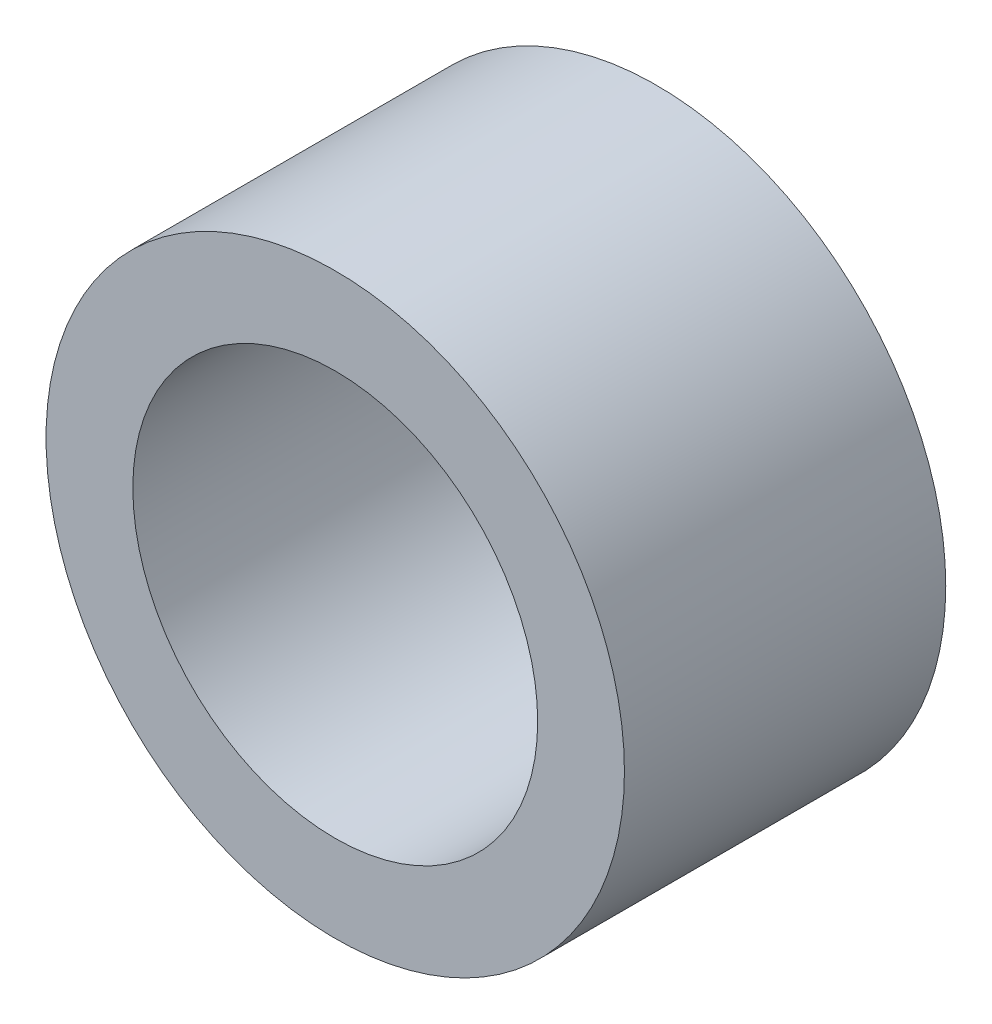
ISO-10303-21;
HEADER;
FILE_DESCRIPTION(('STEP AP214'),'2;1');
FILE_NAME('part.step','',(''),(''),'','','');
FILE_SCHEMA(('AUTOMOTIVE_DESIGN { 1 0 10303 214 1 1 1 1 }'));
ENDSEC;
DATA;
#1=APPLICATION_CONTEXT('core data for automotive mechanical design processes');
#2=APPLICATION_PROTOCOL_DEFINITION('international standard','automotive_design',2000,#1);
#3=PRODUCT_CONTEXT('',#1,'mechanical');
#4=PRODUCT('Part','Part','',(#3));
#5=PRODUCT_RELATED_PRODUCT_CATEGORY('part','',(#4));
#6=PRODUCT_DEFINITION_FORMATION('','',#4);
#7=PRODUCT_DEFINITION_CONTEXT('part definition',#1,'design');
#8=PRODUCT_DEFINITION('design','',#6,#7);
#9=PRODUCT_DEFINITION_SHAPE('','',#8);
#10=(LENGTH_UNIT() NAMED_UNIT(*) SI_UNIT(.MILLI.,.METRE.));
#11=(NAMED_UNIT(*) PLANE_ANGLE_UNIT() SI_UNIT($,.RADIAN.));
#12=(NAMED_UNIT(*) SI_UNIT($,.STERADIAN.) SOLID_ANGLE_UNIT());
#13=UNCERTAINTY_MEASURE_WITH_UNIT(LENGTH_MEASURE(1.E-05),#10,'distance_accuracy_value','');
#14=(GEOMETRIC_REPRESENTATION_CONTEXT(3) GLOBAL_UNCERTAINTY_ASSIGNED_CONTEXT((#13)) GLOBAL_UNIT_ASSIGNED_CONTEXT((#10,
#11,#12)) REPRESENTATION_CONTEXT('',''));
#15=CARTESIAN_POINT('',(0.,0.,0.));
#16=DIRECTION('',(0.,0.,1.));
#17=DIRECTION('',(1.,0.,0.));
#18=AXIS2_PLACEMENT_3D('',#15,#16,#17);
#19=CARTESIAN_POINT('',(0.,0.,5.));
#20=DIRECTION('',(0.,0.,1.));
#21=DIRECTION('',(1.,0.,0.));
#22=AXIS2_PLACEMENT_3D('',#19,#20,#21);
#23=PLANE('',#22);
#24=CARTESIAN_POINT('',(0.,0.,5.));
#25=DIRECTION('',(0.,0.,1.));
#26=DIRECTION('',(1.,0.,0.));
#27=AXIS2_PLACEMENT_3D('',#24,#25,#26);
#28=CIRCLE('',#27,4.5);
#29=CARTESIAN_POINT('',(4.5,0.,5.));
#30=VERTEX_POINT('',#29);
#31=EDGE_CURVE('E10',#30,#30,#28,.T.);
#32=ORIENTED_EDGE('',*,*,#31,.T.);
#33=EDGE_LOOP('',(#32));
#34=FACE_BOUND('',#33,.T.);
#35=CARTESIAN_POINT('',(0.,0.,5.));
#36=DIRECTION('',(0.,0.,1.));
#37=DIRECTION('',(1.,0.,0.));
#38=AXIS2_PLACEMENT_3D('',#35,#36,#37);
#39=CIRCLE('',#38,3.15);
#40=CARTESIAN_POINT('',(3.15,0.,5.));
#41=VERTEX_POINT('',#40);
#42=EDGE_CURVE('E49',#41,#41,#39,.T.);
#43=ORIENTED_EDGE('',*,*,#42,.F.);
#44=EDGE_LOOP('',(#43));
#45=FACE_BOUND('',#44,.T.);
#46=ADVANCED_FACE('F36',(#34,#45),#23,.T.);
#47=CARTESIAN_POINT('',(0.,0.,0.));
#48=DIRECTION('',(0.,0.,1.));
#49=DIRECTION('',(1.,0.,0.));
#50=AXIS2_PLACEMENT_3D('',#47,#48,#49);
#51=PLANE('',#50);
#52=CARTESIAN_POINT('',(0.,0.,0.));
#53=DIRECTION('',(0.,0.,1.));
#54=DIRECTION('',(1.,0.,0.));
#55=AXIS2_PLACEMENT_3D('',#52,#53,#54);
#56=CIRCLE('',#55,4.5);
#57=CARTESIAN_POINT('',(4.5,0.,0.));
#58=VERTEX_POINT('',#57);
#59=EDGE_CURVE('E40',#58,#58,#56,.T.);
#60=ORIENTED_EDGE('',*,*,#59,.F.);
#61=EDGE_LOOP('',(#60));
#62=FACE_BOUND('',#61,.T.);
#63=CARTESIAN_POINT('',(0.,0.,0.));
#64=DIRECTION('',(0.,0.,1.));
#65=DIRECTION('',(1.,0.,0.));
#66=AXIS2_PLACEMENT_3D('',#63,#64,#65);
#67=CIRCLE('',#66,3.15);
#68=CARTESIAN_POINT('',(3.15,0.,0.));
#69=VERTEX_POINT('',#68);
#70=EDGE_CURVE('E51',#69,#69,#67,.T.);
#71=ORIENTED_EDGE('',*,*,#70,.T.);
#72=EDGE_LOOP('',(#71));
#73=FACE_BOUND('',#72,.T.);
#74=ADVANCED_FACE('F63',(#62,#73),#51,.F.);
#75=CARTESIAN_POINT('',(0.,0.,5.));
#76=DIRECTION('',(0.,0.,-1.));
#77=DIRECTION('',(-1.,0.,0.));
#78=AXIS2_PLACEMENT_3D('',#75,#76,#77);
#79=CYLINDRICAL_SURFACE('',#78,4.5);
#80=ORIENTED_EDGE('',*,*,#31,.F.);
#81=EDGE_LOOP('',(#80));
#82=FACE_BOUND('',#81,.T.);
#83=ORIENTED_EDGE('',*,*,#59,.T.);
#84=EDGE_LOOP('',(#83));
#85=FACE_BOUND('',#84,.T.);
#86=ADVANCED_FACE('F38',(#82,#85),#79,.T.);
#87=CARTESIAN_POINT('',(0.,0.,5.));
#88=DIRECTION('',(0.,0.,-1.));
#89=DIRECTION('',(-1.,0.,0.));
#90=AXIS2_PLACEMENT_3D('',#87,#88,#89);
#91=CYLINDRICAL_SURFACE('',#90,3.15);
#92=ORIENTED_EDGE('',*,*,#42,.T.);
#93=EDGE_LOOP('',(#92));
#94=FACE_BOUND('',#93,.T.);
#95=ORIENTED_EDGE('',*,*,#70,.F.);
#96=EDGE_LOOP('',(#95));
#97=FACE_BOUND('',#96,.T.);
#98=ADVANCED_FACE('F59',(#94,#97),#91,.F.);
#99=CLOSED_SHELL('',(#46,#74,#86,#98));
#100=MANIFOLD_SOLID_BREP('B2',#99);
#101=ADVANCED_BREP_SHAPE_REPRESENTATION('',(#18,#100),#14);
#102=SHAPE_DEFINITION_REPRESENTATION(#9,#101);
ENDSEC;
END-ISO-10303-21;
